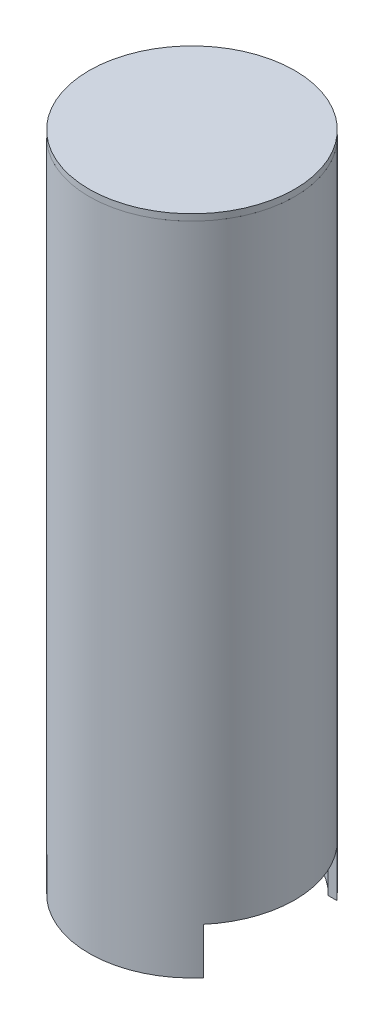
ISO-10303-21;
HEADER;
FILE_DESCRIPTION(('STEP AP214'),'2;1');
FILE_NAME('part.step','',(''),(''),'','','');
FILE_SCHEMA(('AUTOMOTIVE_DESIGN { 1 0 10303 214 1 1 1 1 }'));
ENDSEC;
DATA;
#1=APPLICATION_CONTEXT('core data for automotive mechanical design processes');
#2=APPLICATION_PROTOCOL_DEFINITION('international standard','automotive_design',2000,#1);
#3=PRODUCT_CONTEXT('',#1,'mechanical');
#4=PRODUCT('Part','Part','',(#3));
#5=PRODUCT_RELATED_PRODUCT_CATEGORY('part','',(#4));
#6=PRODUCT_DEFINITION_FORMATION('','',#4);
#7=PRODUCT_DEFINITION_CONTEXT('part definition',#1,'design');
#8=PRODUCT_DEFINITION('design','',#6,#7);
#9=PRODUCT_DEFINITION_SHAPE('','',#8);
#10=(LENGTH_UNIT() NAMED_UNIT(*) SI_UNIT(.MILLI.,.METRE.));
#11=(NAMED_UNIT(*) PLANE_ANGLE_UNIT() SI_UNIT($,.RADIAN.));
#12=(NAMED_UNIT(*) SI_UNIT($,.STERADIAN.) SOLID_ANGLE_UNIT());
#13=UNCERTAINTY_MEASURE_WITH_UNIT(LENGTH_MEASURE(1.E-05),#10,'distance_accuracy_value','');
#14=(GEOMETRIC_REPRESENTATION_CONTEXT(3) GLOBAL_UNCERTAINTY_ASSIGNED_CONTEXT((#13)) GLOBAL_UNIT_ASSIGNED_CONTEXT((#10,
#11,#12)) REPRESENTATION_CONTEXT('',''));
#15=CARTESIAN_POINT('',(0.,0.,0.));
#16=DIRECTION('',(0.,0.,1.));
#17=DIRECTION('',(1.,0.,0.));
#18=AXIS2_PLACEMENT_3D('',#15,#16,#17);
#19=CARTESIAN_POINT('',(0.,28.575,0.));
#20=DIRECTION('',(0.,-1.,0.));
#21=DIRECTION('',(0.,0.,-1.));
#22=AXIS2_PLACEMENT_3D('',#19,#20,#21);
#23=CYLINDRICAL_SURFACE('',#22,3.175);
#24=CARTESIAN_POINT('',(0.,28.575,0.));
#25=DIRECTION('',(0.,1.,0.));
#26=DIRECTION('',(0.,0.,1.));
#27=AXIS2_PLACEMENT_3D('',#24,#25,#26);
#28=CIRCLE('',#27,3.175);
#29=CARTESIAN_POINT('',(0.,28.575,-3.175));
#30=VERTEX_POINT('',#29);
#31=EDGE_CURVE('E58',#30,#30,#28,.T.);
#32=CARTESIAN_POINT('',(0.,26.67,0.));
#33=DIRECTION('',(0.,1.,0.));
#34=DIRECTION('',(0.,0.,1.));
#35=AXIS2_PLACEMENT_3D('',#32,#33,#34);
#36=CIRCLE('',#35,3.175);
#37=CARTESIAN_POINT('',(0.,26.67,-3.175));
#38=VERTEX_POINT('',#37);
#39=EDGE_CURVE('E54',#38,#38,#36,.T.);
#40=CARTESIAN_POINT('',(0.,28.575,-3.175));
#41=CARTESIAN_POINT('',(0.,28.55515625,-3.175));
#42=CARTESIAN_POINT('',(0.,28.5353125,-3.175));
#43=CARTESIAN_POINT('',(0.,28.495625,-3.175));
#44=CARTESIAN_POINT('',(0.,28.47578125,-3.175));
#45=CARTESIAN_POINT('',(0.,28.43609375,-3.175));
#46=CARTESIAN_POINT('',(0.,28.41625,-3.175));
#47=CARTESIAN_POINT('',(0.,28.3765625,-3.175));
#48=CARTESIAN_POINT('',(0.,28.35671875,-3.175));
#49=CARTESIAN_POINT('',(0.,28.31703125,-3.175));
#50=CARTESIAN_POINT('',(0.,28.2971875,-3.175));
#51=CARTESIAN_POINT('',(0.,28.2575,-3.175));
#52=CARTESIAN_POINT('',(0.,28.23765625,-3.175));
#53=CARTESIAN_POINT('',(0.,28.19796875,-3.175));
#54=CARTESIAN_POINT('',(0.,28.178125,-3.175));
#55=CARTESIAN_POINT('',(0.,28.1384375,-3.175));
#56=CARTESIAN_POINT('',(0.,28.11859375,-3.175));
#57=CARTESIAN_POINT('',(0.,28.07890625,-3.175));
#58=CARTESIAN_POINT('',(0.,28.0590625,-3.175));
#59=CARTESIAN_POINT('',(0.,28.019375,-3.175));
#60=CARTESIAN_POINT('',(0.,27.99953125,-3.175));
#61=CARTESIAN_POINT('',(0.,27.95984375,-3.175));
#62=CARTESIAN_POINT('',(0.,27.94,-3.175));
#63=CARTESIAN_POINT('',(0.,27.9003125,-3.175));
#64=CARTESIAN_POINT('',(0.,27.88046875,-3.175));
#65=CARTESIAN_POINT('',(0.,27.84078125,-3.175));
#66=CARTESIAN_POINT('',(0.,27.8209375,-3.175));
#67=CARTESIAN_POINT('',(0.,27.78125,-3.175));
#68=CARTESIAN_POINT('',(0.,27.76140625,-3.175));
#69=CARTESIAN_POINT('',(0.,27.72171875,-3.175));
#70=CARTESIAN_POINT('',(0.,27.701875,-3.175));
#71=CARTESIAN_POINT('',(0.,27.6621875,-3.175));
#72=CARTESIAN_POINT('',(0.,27.64234375,-3.175));
#73=CARTESIAN_POINT('',(0.,27.60265625,-3.175));
#74=CARTESIAN_POINT('',(0.,27.5828125,-3.175));
#75=CARTESIAN_POINT('',(0.,27.543125,-3.175));
#76=CARTESIAN_POINT('',(0.,27.52328125,-3.175));
#77=CARTESIAN_POINT('',(0.,27.48359375,-3.175));
#78=CARTESIAN_POINT('',(0.,27.46375,-3.175));
#79=CARTESIAN_POINT('',(0.,27.4240625,-3.175));
#80=CARTESIAN_POINT('',(0.,27.40421875,-3.175));
#81=CARTESIAN_POINT('',(0.,27.36453125,-3.175));
#82=CARTESIAN_POINT('',(0.,27.3446875,-3.175));
#83=CARTESIAN_POINT('',(0.,27.305,-3.175));
#84=CARTESIAN_POINT('',(0.,27.28515625,-3.175));
#85=CARTESIAN_POINT('',(0.,27.24546875,-3.175));
#86=CARTESIAN_POINT('',(0.,27.225625,-3.175));
#87=CARTESIAN_POINT('',(0.,27.1859375,-3.175));
#88=CARTESIAN_POINT('',(0.,27.16609375,-3.175));
#89=CARTESIAN_POINT('',(0.,27.12640625,-3.175));
#90=CARTESIAN_POINT('',(0.,27.1065625,-3.175));
#91=CARTESIAN_POINT('',(0.,27.066875,-3.175));
#92=CARTESIAN_POINT('',(0.,27.04703125,-3.175));
#93=CARTESIAN_POINT('',(0.,27.00734375,-3.175));
#94=CARTESIAN_POINT('',(0.,26.9875,-3.175));
#95=CARTESIAN_POINT('',(0.,26.9478125,-3.175));
#96=CARTESIAN_POINT('',(0.,26.92796875,-3.175));
#97=CARTESIAN_POINT('',(0.,26.88828125,-3.175));
#98=CARTESIAN_POINT('',(0.,26.8684375,-3.175));
#99=CARTESIAN_POINT('',(0.,26.82875,-3.175));
#100=CARTESIAN_POINT('',(0.,26.80890625,-3.175));
#101=CARTESIAN_POINT('',(0.,26.76921875,-3.175));
#102=CARTESIAN_POINT('',(0.,26.749375,-3.175));
#103=CARTESIAN_POINT('',(0.,26.7096875,-3.175));
#104=CARTESIAN_POINT('',(0.,26.68984375,-3.175));
#105=CARTESIAN_POINT('',(0.,26.67,-3.175));
#106=B_SPLINE_CURVE_WITH_KNOTS('',3,(#40,#41,#42,#43,#44,#45,#46,#47,#48,#49,#50,#51,#52,#53,
#54,#55,#56,#57,#58,#59,#60,#61,#62,#63,#64,#65,#66,#67,#68,#69,#70,#71,#72,#73,#74,#75,#76,#77,
#78,#79,#80,#81,#82,#83,#84,#85,#86,#87,#88,#89,#90,#91,#92,#93,#94,#95,#96,#97,#98,#99,#100,
#101,#102,#103,#104,#105),.UNSPECIFIED.,.F.,.F.,(4,2,2,2,2,2,2,2,2,2,2,2,2,2,2,2,2,2,2,2,2,2,2,
2,2,2,2,2,2,2,2,2,4),(0.,0.0595312500000014,0.119062500000003,0.178593750000001,
0.238125000000002,0.29765625,0.357187500000002,0.416718750000003,0.476250000000001,
0.535781250000002,0.5953125,0.654843750000002,0.714375000000003,0.773906250000001,
0.833437500000003,0.892968750000001,0.952500000000002,1.01203125,1.0715625,1.13109375,1.190625,
1.25015625,1.3096875,1.36921875,1.42875,1.48828125,1.5478125,1.60734375,1.666875,1.72640625,
1.7859375,1.84546875,1.905),.UNSPECIFIED.);
#107=EDGE_CURVE('BSEAM51',#30,#38,#106,.T.);
#108=ORIENTED_EDGE('',*,*,#31,.F.);
#109=ORIENTED_EDGE('',*,*,#39,.T.);
#110=ORIENTED_EDGE('',*,*,#107,.T.);
#111=ORIENTED_EDGE('',*,*,#107,.F.);
#112=EDGE_LOOP('',(#108,#110,#109,#111));
#113=FACE_BOUND('',#112,.T.);
#114=ADVANCED_FACE('F51',(#113),#23,.T.);
#115=CARTESIAN_POINT('',(0.,28.575,0.));
#116=DIRECTION('',(0.,1.,0.));
#117=DIRECTION('',(0.,0.,1.));
#118=AXIS2_PLACEMENT_3D('',#115,#116,#117);
#119=PLANE('',#118);
#120=CARTESIAN_POINT('',(0.,28.575,0.));
#121=DIRECTION('',(0.,1.,0.));
#122=DIRECTION('',(0.,0.,1.));
#123=AXIS2_PLACEMENT_3D('',#120,#121,#122);
#124=CIRCLE('',#123,1.905);
#125=CARTESIAN_POINT('',(0.,28.575,1.905));
#126=VERTEX_POINT('',#125);
#127=EDGE_CURVE('E11',#126,#126,#124,.T.);
#128=ORIENTED_EDGE('',*,*,#127,.F.);
#129=EDGE_LOOP('',(#128));
#130=FACE_BOUND('',#129,.T.);
#131=ORIENTED_EDGE('',*,*,#31,.T.);
#132=EDGE_LOOP('',(#131));
#133=FACE_BOUND('',#132,.T.);
#134=ADVANCED_FACE('F75',(#130,#133),#119,.T.);
#135=CARTESIAN_POINT('',(0.,26.67,0.));
#136=DIRECTION('',(0.,1.,0.));
#137=DIRECTION('',(0.,0.,1.));
#138=AXIS2_PLACEMENT_3D('',#135,#136,#137);
#139=PLANE('',#138);
#140=ORIENTED_EDGE('',*,*,#39,.F.);
#141=EDGE_LOOP('',(#140));
#142=FACE_BOUND('',#141,.T.);
#143=ADVANCED_FACE('F72',(#142),#139,.F.);
#144=CARTESIAN_POINT('',(0.,29.21,0.));
#145=DIRECTION('',(0.,-1.,0.));
#146=DIRECTION('',(0.,0.,-1.));
#147=AXIS2_PLACEMENT_3D('',#144,#145,#146);
#148=CYLINDRICAL_SURFACE('',#147,1.905);
#149=CARTESIAN_POINT('',(0.,29.21,0.));
#150=DIRECTION('',(0.,1.,0.));
#151=DIRECTION('',(0.,0.,1.));
#152=AXIS2_PLACEMENT_3D('',#149,#150,#151);
#153=CIRCLE('',#152,1.905);
#154=CARTESIAN_POINT('',(0.,29.21,1.905));
#155=VERTEX_POINT('',#154);
#156=EDGE_CURVE('E64',#155,#155,#153,.T.);
#157=ORIENTED_EDGE('',*,*,#156,.F.);
#158=EDGE_LOOP('',(#157));
#159=FACE_BOUND('',#158,.T.);
#160=ORIENTED_EDGE('',*,*,#127,.T.);
#161=EDGE_LOOP('',(#160));
#162=FACE_BOUND('',#161,.T.);
#163=ADVANCED_FACE('F74',(#159,#162),#148,.T.);
#164=CARTESIAN_POINT('',(0.,29.21,0.));
#165=DIRECTION('',(0.,1.,0.));
#166=DIRECTION('',(0.,0.,1.));
#167=AXIS2_PLACEMENT_3D('',#164,#165,#166);
#168=PLANE('',#167);
#169=ORIENTED_EDGE('',*,*,#156,.T.);
#170=EDGE_LOOP('',(#169));
#171=FACE_BOUND('',#170,.T.);
#172=ADVANCED_FACE('F80',(#171),#168,.T.);
#173=CLOSED_SHELL('',(#114,#134,#143,#163,#172));
#174=MANIFOLD_SOLID_BREP('B2',#173);
#175=CARTESIAN_POINT('',(0.,318.135,0.));
#176=DIRECTION('',(0.,1.,0.));
#177=DIRECTION('',(0.,0.,1.));
#178=AXIS2_PLACEMENT_3D('',#175,#176,#177);
#179=CYLINDRICAL_SURFACE('',#178,46.99);
#180=CARTESIAN_POINT('',(0.,318.135,0.));
#181=DIRECTION('',(0.,1.,0.));
#182=DIRECTION('',(0.,0.,1.));
#183=AXIS2_PLACEMENT_3D('',#180,#181,#182);
#184=CIRCLE('',#183,46.99);
#185=CARTESIAN_POINT('',(0.,318.135,46.99));
#186=VERTEX_POINT('',#185);
#187=EDGE_CURVE('E50',#186,#186,#184,.T.);
#188=ORIENTED_EDGE('',*,*,#187,.T.);
#189=EDGE_LOOP('',(#188));
#190=FACE_BOUND('',#189,.T.);
#191=CARTESIAN_POINT('',(0.,323.85,0.));
#192=DIRECTION('',(0.,1.,0.));
#193=DIRECTION('',(0.,0.,1.));
#194=AXIS2_PLACEMENT_3D('',#191,#192,#193);
#195=CIRCLE('',#194,46.99);
#196=CARTESIAN_POINT('',(0.,323.85,46.99));
#197=VERTEX_POINT('',#196);
#198=EDGE_CURVE('E138',#197,#197,#195,.T.);
#199=ORIENTED_EDGE('',*,*,#198,.F.);
#200=EDGE_LOOP('',(#199));
#201=FACE_BOUND('',#200,.T.);
#202=ADVANCED_FACE('F135',(#190,#201),#179,.T.);
#203=CARTESIAN_POINT('',(0.,318.135,0.));
#204=DIRECTION('',(0.,1.,0.));
#205=DIRECTION('',(0.,0.,1.));
#206=AXIS2_PLACEMENT_3D('',#203,#204,#205);
#207=PLANE('',#206);
#208=ORIENTED_EDGE('',*,*,#187,.F.);
#209=EDGE_LOOP('',(#208));
#210=FACE_BOUND('',#209,.T.);
#211=ADVANCED_FACE('F158',(#210),#207,.F.);
#212=CARTESIAN_POINT('',(0.,327.025,0.));
#213=DIRECTION('',(0.,-1.,0.));
#214=DIRECTION('',(0.,0.,-1.));
#215=AXIS2_PLACEMENT_3D('',#212,#213,#214);
#216=CYLINDRICAL_SURFACE('',#215,50.8);
#217=CARTESIAN_POINT('',(0.,327.025,0.));
#218=DIRECTION('',(0.,1.,0.));
#219=DIRECTION('',(0.,0.,1.));
#220=AXIS2_PLACEMENT_3D('',#217,#218,#219);
#221=CIRCLE('',#220,50.8);
#222=CARTESIAN_POINT('',(0.,327.025,-50.8));
#223=VERTEX_POINT('',#222);
#224=EDGE_CURVE('E145',#223,#223,#221,.T.);
#225=CARTESIAN_POINT('',(0.,323.85,0.));
#226=DIRECTION('',(0.,1.,0.));
#227=DIRECTION('',(0.,0.,1.));
#228=AXIS2_PLACEMENT_3D('',#225,#226,#227);
#229=CIRCLE('',#228,50.8);
#230=CARTESIAN_POINT('',(0.,323.85,-50.8));
#231=VERTEX_POINT('',#230);
#232=EDGE_CURVE('E147',#231,#231,#229,.T.);
#233=CARTESIAN_POINT('',(0.,327.025,-50.8));
#234=CARTESIAN_POINT('',(0.,326.991927083333,-50.8));
#235=CARTESIAN_POINT('',(0.,326.958854166667,-50.8));
#236=CARTESIAN_POINT('',(0.,326.892708333333,-50.8));
#237=CARTESIAN_POINT('',(0.,326.859635416667,-50.8));
#238=CARTESIAN_POINT('',(0.,326.793489583333,-50.8));
#239=CARTESIAN_POINT('',(0.,326.760416666667,-50.8));
#240=CARTESIAN_POINT('',(0.,326.694270833333,-50.8));
#241=CARTESIAN_POINT('',(0.,326.661197916667,-50.8));
#242=CARTESIAN_POINT('',(0.,326.595052083333,-50.8));
#243=CARTESIAN_POINT('',(0.,326.561979166667,-50.8));
#244=CARTESIAN_POINT('',(0.,326.495833333333,-50.8));
#245=CARTESIAN_POINT('',(0.,326.462760416667,-50.8));
#246=CARTESIAN_POINT('',(0.,326.396614583333,-50.8));
#247=CARTESIAN_POINT('',(0.,326.363541666667,-50.8));
#248=CARTESIAN_POINT('',(0.,326.297395833333,-50.8));
#249=CARTESIAN_POINT('',(0.,326.264322916667,-50.8));
#250=CARTESIAN_POINT('',(0.,326.198177083333,-50.8));
#251=CARTESIAN_POINT('',(0.,326.165104166667,-50.8));
#252=CARTESIAN_POINT('',(0.,326.098958333333,-50.8));
#253=CARTESIAN_POINT('',(0.,326.065885416667,-50.8));
#254=CARTESIAN_POINT('',(0.,325.999739583333,-50.8));
#255=CARTESIAN_POINT('',(0.,325.966666666667,-50.8));
#256=CARTESIAN_POINT('',(0.,325.900520833333,-50.8));
#257=CARTESIAN_POINT('',(0.,325.867447916667,-50.8));
#258=CARTESIAN_POINT('',(0.,325.801302083333,-50.8));
#259=CARTESIAN_POINT('',(0.,325.768229166667,-50.8));
#260=CARTESIAN_POINT('',(0.,325.702083333333,-50.8));
#261=CARTESIAN_POINT('',(0.,325.669010416667,-50.8));
#262=CARTESIAN_POINT('',(0.,325.602864583333,-50.8));
#263=CARTESIAN_POINT('',(0.,325.569791666667,-50.8));
#264=CARTESIAN_POINT('',(0.,325.503645833333,-50.8));
#265=CARTESIAN_POINT('',(0.,325.470572916667,-50.8));
#266=CARTESIAN_POINT('',(0.,325.404427083333,-50.8));
#267=CARTESIAN_POINT('',(0.,325.371354166667,-50.8));
#268=CARTESIAN_POINT('',(0.,325.305208333333,-50.8));
#269=CARTESIAN_POINT('',(0.,325.272135416667,-50.8));
#270=CARTESIAN_POINT('',(0.,325.205989583333,-50.8));
#271=CARTESIAN_POINT('',(0.,325.172916666667,-50.8));
#272=CARTESIAN_POINT('',(0.,325.106770833333,-50.8));
#273=CARTESIAN_POINT('',(0.,325.073697916667,-50.8));
#274=CARTESIAN_POINT('',(0.,325.007552083333,-50.8));
#275=CARTESIAN_POINT('',(0.,324.974479166667,-50.8));
#276=CARTESIAN_POINT('',(0.,324.908333333333,-50.8));
#277=CARTESIAN_POINT('',(0.,324.875260416667,-50.8));
#278=CARTESIAN_POINT('',(0.,324.809114583333,-50.8));
#279=CARTESIAN_POINT('',(0.,324.776041666667,-50.8));
#280=CARTESIAN_POINT('',(0.,324.709895833333,-50.8));
#281=CARTESIAN_POINT('',(0.,324.676822916667,-50.8));
#282=CARTESIAN_POINT('',(0.,324.610677083333,-50.8));
#283=CARTESIAN_POINT('',(0.,324.577604166667,-50.8));
#284=CARTESIAN_POINT('',(0.,324.511458333333,-50.8));
#285=CARTESIAN_POINT('',(0.,324.478385416667,-50.8));
#286=CARTESIAN_POINT('',(0.,324.412239583333,-50.8));
#287=CARTESIAN_POINT('',(0.,324.379166666667,-50.8));
#288=CARTESIAN_POINT('',(0.,324.313020833333,-50.8));
#289=CARTESIAN_POINT('',(0.,324.279947916667,-50.8));
#290=CARTESIAN_POINT('',(0.,324.213802083333,-50.8));
#291=CARTESIAN_POINT('',(0.,324.180729166667,-50.8));
#292=CARTESIAN_POINT('',(0.,324.114583333333,-50.8));
#293=CARTESIAN_POINT('',(0.,324.081510416667,-50.8));
#294=CARTESIAN_POINT('',(0.,324.015364583333,-50.8));
#295=CARTESIAN_POINT('',(0.,323.982291666667,-50.8));
#296=CARTESIAN_POINT('',(0.,323.916145833333,-50.8));
#297=CARTESIAN_POINT('',(0.,323.883072916667,-50.8));
#298=CARTESIAN_POINT('',(0.,323.85,-50.8));
#299=B_SPLINE_CURVE_WITH_KNOTS('',3,(#233,#234,#235,#236,#237,#238,#239,#240,#241,#242,#243,
#244,#245,#246,#247,#248,#249,#250,#251,#252,#253,#254,#255,#256,#257,#258,#259,#260,#261,#262,
#263,#264,#265,#266,#267,#268,#269,#270,#271,#272,#273,#274,#275,#276,#277,#278,#279,#280,#281,
#282,#283,#284,#285,#286,#287,#288,#289,#290,#291,#292,#293,#294,#295,#296,#297,#298),
.UNSPECIFIED.,.F.,.F.,(4,2,2,2,2,2,2,2,2,2,2,2,2,2,2,2,2,2,2,2,2,2,2,2,2,2,2,2,2,2,2,2,4),(0.,
0.0992187499999631,0.198437499999982,0.297656249999945,0.396874999999963,0.496093749999982,
0.595312499999945,0.694531249999963,0.793749999999982,0.892968749999945,0.992187499999964,
1.09140624999998,1.19062499999995,1.28984374999996,1.38906249999998,1.48828124999995,
1.58749999999996,1.68671874999998,1.78593749999995,1.88515624999996,1.98437499999998,
2.08359374999995,2.18281249999996,2.28203124999998,2.38124999999995,2.48046874999996,
2.57968749999998,2.67890624999995,2.77812499999996,2.87734374999998,2.97656249999995,
3.07578124999996,3.17499999999998),.UNSPECIFIED.);
#300=EDGE_CURVE('BSEAM155',#223,#231,#299,.T.);
#301=ORIENTED_EDGE('',*,*,#224,.F.);
#302=ORIENTED_EDGE('',*,*,#232,.T.);
#303=ORIENTED_EDGE('',*,*,#300,.T.);
#304=ORIENTED_EDGE('',*,*,#300,.F.);
#305=EDGE_LOOP('',(#301,#303,#302,#304));
#306=FACE_BOUND('',#305,.T.);
#307=ADVANCED_FACE('F155',(#306),#216,.T.);
#308=CARTESIAN_POINT('',(0.,327.025,0.));
#309=DIRECTION('',(0.,1.,0.));
#310=DIRECTION('',(0.,0.,1.));
#311=AXIS2_PLACEMENT_3D('',#308,#309,#310);
#312=PLANE('',#311);
#313=ORIENTED_EDGE('',*,*,#224,.T.);
#314=EDGE_LOOP('',(#313));
#315=FACE_BOUND('',#314,.T.);
#316=ADVANCED_FACE('F153',(#315),#312,.T.);
#317=CARTESIAN_POINT('',(0.,323.85,0.));
#318=DIRECTION('',(0.,1.,0.));
#319=DIRECTION('',(0.,0.,1.));
#320=AXIS2_PLACEMENT_3D('',#317,#318,#319);
#321=PLANE('',#320);
#322=ORIENTED_EDGE('',*,*,#198,.T.);
#323=EDGE_LOOP('',(#322));
#324=FACE_BOUND('',#323,.T.);
#325=ORIENTED_EDGE('',*,*,#232,.F.);
#326=EDGE_LOOP('',(#325));
#327=FACE_BOUND('',#326,.T.);
#328=ADVANCED_FACE('F162',(#324,#327),#321,.F.);
#329=CLOSED_SHELL('',(#202,#211,#307,#316,#328));
#330=MANIFOLD_SOLID_BREP('B6',#329);
#331=CARTESIAN_POINT('',(0.,323.85,0.));
#332=DIRECTION('',(0.,-1.,0.));
#333=DIRECTION('',(0.,0.,-1.));
#334=AXIS2_PLACEMENT_3D('',#331,#332,#333);
#335=CYLINDRICAL_SURFACE('',#334,50.8);
#336=CARTESIAN_POINT('',(0.,323.85,0.));
#337=DIRECTION('',(0.,1.,0.));
#338=DIRECTION('',(0.,0.,1.));
#339=AXIS2_PLACEMENT_3D('',#336,#337,#338);
#340=CIRCLE('',#339,50.8);
#341=CARTESIAN_POINT('',(0.,323.85,50.8));
#342=VERTEX_POINT('',#341);
#343=EDGE_CURVE('E279',#342,#342,#340,.T.);
#344=ORIENTED_EDGE('',*,*,#343,.F.);
#345=EDGE_LOOP('',(#344));
#346=FACE_BOUND('',#345,.T.);
#347=DIRECTION('',(0.,-1.,0.));
#348=VECTOR('',#347,1.);
#349=CARTESIAN_POINT('',(38.6046577500695,323.85,33.02));
#350=LINE('',#349,#348);
#351=CARTESIAN_POINT('',(38.6046577500695,22.86,33.02));
#352=VERTEX_POINT('',#351);
#353=CARTESIAN_POINT('',(38.6046577500695,0.,33.02));
#354=VERTEX_POINT('',#353);
#355=EDGE_CURVE('E263',#352,#354,#350,.T.);
#356=ORIENTED_EDGE('',*,*,#355,.F.);
#357=CARTESIAN_POINT('',(0.,22.86,0.));
#358=DIRECTION('',(0.,-1.,0.));
#359=DIRECTION('',(0.,0.,-1.));
#360=AXIS2_PLACEMENT_3D('',#357,#358,#359);
#361=CIRCLE('',#360,50.8);
#362=CARTESIAN_POINT('',(38.6046577500695,22.86,-33.02));
#363=VERTEX_POINT('',#362);
#364=EDGE_CURVE('E253',#363,#352,#361,.T.);
#365=ORIENTED_EDGE('',*,*,#364,.F.);
#366=DIRECTION('',(0.,-1.,0.));
#367=VECTOR('',#366,1.);
#368=CARTESIAN_POINT('',(38.6046577500697,323.85,-33.0199999999998));
#369=LINE('',#368,#367);
#370=CARTESIAN_POINT('',(38.6046577500695,0.,-33.02));
#371=VERTEX_POINT('',#370);
#372=EDGE_CURVE('E260',#371,#363,#369,.F.);
#373=ORIENTED_EDGE('',*,*,#372,.F.);
#374=CARTESIAN_POINT('',(0.,0.,0.));
#375=DIRECTION('',(0.,1.,0.));
#376=DIRECTION('',(0.,0.,1.));
#377=AXIS2_PLACEMENT_3D('',#374,#375,#376);
#378=CIRCLE('',#377,50.8);
#379=EDGE_CURVE('E269',#371,#354,#378,.T.);
#380=ORIENTED_EDGE('',*,*,#379,.T.);
#381=EDGE_LOOP('',(#356,#365,#373,#380));
#382=FACE_BOUND('',#381,.T.);
#383=ADVANCED_FACE('F214',(#346,#382),#335,.T.);
#384=CARTESIAN_POINT('',(0.,0.,0.));
#385=DIRECTION('',(0.,1.,0.));
#386=DIRECTION('',(0.,0.,1.));
#387=AXIS2_PLACEMENT_3D('',#384,#385,#386);
#388=PLANE('',#387);
#389=DIRECTION('',(-1.,0.,0.));
#390=VECTOR('',#389,1.);
#391=CARTESIAN_POINT('',(58.42,0.,33.02));
#392=LINE('',#391,#390);
#393=CARTESIAN_POINT('',(34.319385556854,0.,33.02));
#394=VERTEX_POINT('',#393);
#395=EDGE_CURVE('E235',#354,#394,#392,.T.);
#396=ORIENTED_EDGE('',*,*,#395,.F.);
#397=ORIENTED_EDGE('',*,*,#379,.F.);
#398=DIRECTION('',(-1.,0.,0.));
#399=VECTOR('',#398,1.);
#400=CARTESIAN_POINT('',(58.42,0.,-33.02));
#401=LINE('',#400,#399);
#402=CARTESIAN_POINT('',(34.319385556854,0.,-33.02));
#403=VERTEX_POINT('',#402);
#404=EDGE_CURVE('E289',#371,#403,#401,.T.);
#405=ORIENTED_EDGE('',*,*,#404,.T.);
#406=CARTESIAN_POINT('',(0.,0.,0.));
#407=DIRECTION('',(0.,-1.,0.));
#408=DIRECTION('',(0.,0.,-1.));
#409=AXIS2_PLACEMENT_3D('',#406,#407,#408);
#410=CIRCLE('',#409,47.625);
#411=EDGE_CURVE('E270',#394,#403,#410,.T.);
#412=ORIENTED_EDGE('',*,*,#411,.F.);
#413=EDGE_LOOP('',(#396,#397,#405,#412));
#414=FACE_BOUND('',#413,.T.);
#415=ADVANCED_FACE('F293',(#414),#388,.F.);
#416=CARTESIAN_POINT('',(0.,25.4,0.));
#417=DIRECTION('',(0.,-1.,0.));
#418=DIRECTION('',(0.,0.,-1.));
#419=AXIS2_PLACEMENT_3D('',#416,#417,#418);
#420=CYLINDRICAL_SURFACE('',#419,47.625);
#421=CARTESIAN_POINT('',(0.,25.4,0.));
#422=DIRECTION('',(0.,-1.,0.));
#423=DIRECTION('',(0.,0.,-1.));
#424=AXIS2_PLACEMENT_3D('',#421,#422,#423);
#425=CIRCLE('',#424,47.625);
#426=CARTESIAN_POINT('',(0.,25.4,-47.625));
#427=VERTEX_POINT('',#426);
#428=EDGE_CURVE('E273',#427,#427,#425,.T.);
#429=ORIENTED_EDGE('',*,*,#428,.F.);
#430=EDGE_LOOP('',(#429));
#431=FACE_BOUND('',#430,.T.);
#432=DIRECTION('',(0.,-1.,0.));
#433=VECTOR('',#432,1.);
#434=CARTESIAN_POINT('',(34.319385556854,25.4,33.02));
#435=LINE('',#434,#433);
#436=CARTESIAN_POINT('',(34.319385556854,22.86,33.02));
#437=VERTEX_POINT('',#436);
#438=EDGE_CURVE('E133',#394,#437,#435,.F.);
#439=ORIENTED_EDGE('',*,*,#438,.F.);
#440=ORIENTED_EDGE('',*,*,#411,.T.);
#441=DIRECTION('',(0.,-1.,0.));
#442=VECTOR('',#441,1.);
#443=CARTESIAN_POINT('',(34.319385556854,25.4,-33.02));
#444=LINE('',#443,#442);
#445=CARTESIAN_POINT('',(34.319385556854,22.86,-33.02));
#446=VERTEX_POINT('',#445);
#447=EDGE_CURVE('E222',#446,#403,#444,.T.);
#448=ORIENTED_EDGE('',*,*,#447,.F.);
#449=CARTESIAN_POINT('',(0.,22.86,0.));
#450=DIRECTION('',(0.,-1.,0.));
#451=DIRECTION('',(0.,0.,-1.));
#452=AXIS2_PLACEMENT_3D('',#449,#450,#451);
#453=CIRCLE('',#452,47.625);
#454=EDGE_CURVE('E282',#437,#446,#453,.F.);
#455=ORIENTED_EDGE('',*,*,#454,.F.);
#456=EDGE_LOOP('',(#439,#440,#448,#455));
#457=FACE_BOUND('',#456,.T.);
#458=ADVANCED_FACE('F295',(#431,#457),#420,.F.);
#459=CARTESIAN_POINT('',(0.,323.85,0.));
#460=DIRECTION('',(0.,1.,0.));
#461=DIRECTION('',(0.,0.,1.));
#462=AXIS2_PLACEMENT_3D('',#459,#460,#461);
#463=PLANE('',#462);
#464=CARTESIAN_POINT('',(0.,323.85,0.));
#465=DIRECTION('',(0.,1.,0.));
#466=DIRECTION('',(0.,0.,1.));
#467=AXIS2_PLACEMENT_3D('',#464,#465,#466);
#468=CIRCLE('',#467,47.625);
#469=CARTESIAN_POINT('',(0.,323.85,47.625));
#470=VERTEX_POINT('',#469);
#471=EDGE_CURVE('E265',#470,#470,#468,.T.);
#472=ORIENTED_EDGE('',*,*,#471,.F.);
#473=EDGE_LOOP('',(#472));
#474=FACE_BOUND('',#473,.T.);
#475=ORIENTED_EDGE('',*,*,#343,.T.);
#476=EDGE_LOOP('',(#475));
#477=FACE_BOUND('',#476,.T.);
#478=ADVANCED_FACE('F297',(#474,#477),#463,.T.);
#479=CARTESIAN_POINT('',(0.,25.4,0.));
#480=DIRECTION('',(0.,-1.,0.));
#481=DIRECTION('',(0.,0.,-1.));
#482=AXIS2_PLACEMENT_3D('',#479,#480,#481);
#483=PLANE('',#482);
#484=CARTESIAN_POINT('',(0.,25.4,0.));
#485=DIRECTION('',(0.,-1.,0.));
#486=DIRECTION('',(0.,0.,-1.));
#487=AXIS2_PLACEMENT_3D('',#484,#485,#486);
#488=CIRCLE('',#487,1.27);
#489=CARTESIAN_POINT('',(0.,25.4,-1.27));
#490=VERTEX_POINT('',#489);
#491=EDGE_CURVE('E400',#490,#490,#488,.T.);
#492=ORIENTED_EDGE('',*,*,#491,.F.);
#493=EDGE_LOOP('',(#492));
#494=FACE_BOUND('',#493,.T.);
#495=ORIENTED_EDGE('',*,*,#428,.T.);
#496=EDGE_LOOP('',(#495));
#497=FACE_BOUND('',#496,.T.);
#498=ADVANCED_FACE('F304',(#494,#497),#483,.T.);
#499=CARTESIAN_POINT('',(58.42,0.,33.02));
#500=DIRECTION('',(0.,0.,-1.));
#501=DIRECTION('',(-1.,0.,0.));
#502=AXIS2_PLACEMENT_3D('',#499,#500,#501);
#503=PLANE('',#502);
#504=ORIENTED_EDGE('',*,*,#355,.T.);
#505=ORIENTED_EDGE('',*,*,#395,.T.);
#506=ORIENTED_EDGE('',*,*,#438,.T.);
#507=DIRECTION('',(-1.,0.,0.));
#508=VECTOR('',#507,1.);
#509=CARTESIAN_POINT('',(58.42,22.86,33.02));
#510=LINE('',#509,#508);
#511=EDGE_CURVE('E229',#352,#437,#510,.T.);
#512=ORIENTED_EDGE('',*,*,#511,.F.);
#513=EDGE_LOOP('',(#504,#505,#506,#512));
#514=FACE_BOUND('',#513,.T.);
#515=ADVANCED_FACE('F262',(#514),#503,.T.);
#516=CARTESIAN_POINT('',(58.42,22.86,-33.02));
#517=DIRECTION('',(0.,0.,1.));
#518=DIRECTION('',(0.,-1.,0.));
#519=AXIS2_PLACEMENT_3D('',#516,#517,#518);
#520=PLANE('',#519);
#521=ORIENTED_EDGE('',*,*,#372,.T.);
#522=DIRECTION('',(-1.,0.,0.));
#523=VECTOR('',#522,1.);
#524=CARTESIAN_POINT('',(58.42,22.86,-33.02));
#525=LINE('',#524,#523);
#526=EDGE_CURVE('E256',#363,#446,#525,.T.);
#527=ORIENTED_EDGE('',*,*,#526,.T.);
#528=ORIENTED_EDGE('',*,*,#447,.T.);
#529=ORIENTED_EDGE('',*,*,#404,.F.);
#530=EDGE_LOOP('',(#521,#527,#528,#529));
#531=FACE_BOUND('',#530,.T.);
#532=ADVANCED_FACE('F288',(#531),#520,.T.);
#533=CARTESIAN_POINT('',(58.42,22.86,33.02));
#534=DIRECTION('',(0.,-1.,0.));
#535=DIRECTION('',(0.,0.,-1.));
#536=AXIS2_PLACEMENT_3D('',#533,#534,#535);
#537=PLANE('',#536);
#538=ORIENTED_EDGE('',*,*,#364,.T.);
#539=ORIENTED_EDGE('',*,*,#511,.T.);
#540=ORIENTED_EDGE('',*,*,#454,.T.);
#541=ORIENTED_EDGE('',*,*,#526,.F.);
#542=EDGE_LOOP('',(#538,#539,#540,#541));
#543=FACE_BOUND('',#542,.T.);
#544=ADVANCED_FACE('F254',(#543),#537,.T.);
#545=CARTESIAN_POINT('',(0.,323.85,0.));
#546=DIRECTION('',(0.,-1.,0.));
#547=DIRECTION('',(0.,0.,-1.));
#548=AXIS2_PLACEMENT_3D('',#545,#546,#547);
#549=CYLINDRICAL_SURFACE('',#548,47.625);
#550=ORIENTED_EDGE('',*,*,#471,.T.);
#551=EDGE_LOOP('',(#550));
#552=FACE_BOUND('',#551,.T.);
#553=CARTESIAN_POINT('',(0.,26.67,0.));
#554=DIRECTION('',(0.,1.,0.));
#555=DIRECTION('',(0.,0.,1.));
#556=AXIS2_PLACEMENT_3D('',#553,#554,#555);
#557=CIRCLE('',#556,47.625);
#558=CARTESIAN_POINT('',(0.,26.67,47.625));
#559=VERTEX_POINT('',#558);
#560=EDGE_CURVE('E402',#559,#559,#557,.T.);
#561=ORIENTED_EDGE('',*,*,#560,.F.);
#562=EDGE_LOOP('',(#561));
#563=FACE_BOUND('',#562,.T.);
#564=ADVANCED_FACE('F350',(#552,#563),#549,.F.);
#565=CARTESIAN_POINT('',(0.,26.67,0.));
#566=DIRECTION('',(0.,1.,0.));
#567=DIRECTION('',(0.,0.,1.));
#568=AXIS2_PLACEMENT_3D('',#565,#566,#567);
#569=PLANE('',#568);
#570=CARTESIAN_POINT('',(0.,26.67,0.));
#571=DIRECTION('',(0.,1.,0.));
#572=DIRECTION('',(0.,0.,1.));
#573=AXIS2_PLACEMENT_3D('',#570,#571,#572);
#574=CIRCLE('',#573,1.27);
#575=CARTESIAN_POINT('',(0.,26.67,1.27));
#576=VERTEX_POINT('',#575);
#577=EDGE_CURVE('E217',#576,#576,#574,.T.);
#578=ORIENTED_EDGE('',*,*,#577,.F.);
#579=EDGE_LOOP('',(#578));
#580=FACE_BOUND('',#579,.T.);
#581=ORIENTED_EDGE('',*,*,#560,.T.);
#582=EDGE_LOOP('',(#581));
#583=FACE_BOUND('',#582,.T.);
#584=ADVANCED_FACE('F365',(#580,#583),#569,.T.);
#585=CARTESIAN_POINT('',(0.,27.178,0.));
#586=DIRECTION('',(0.,-1.,0.));
#587=DIRECTION('',(0.,0.,-1.));
#588=AXIS2_PLACEMENT_3D('',#585,#586,#587);
#589=CYLINDRICAL_SURFACE('',#588,1.27);
#590=ORIENTED_EDGE('',*,*,#577,.T.);
#591=EDGE_LOOP('',(#590));
#592=FACE_BOUND('',#591,.T.);
#593=ORIENTED_EDGE('',*,*,#491,.T.);
#594=EDGE_LOOP('',(#593));
#595=FACE_BOUND('',#594,.T.);
#596=ADVANCED_FACE('F381',(#592,#595),#589,.F.);
#597=CLOSED_SHELL('',(#383,#415,#458,#478,#498,#515,#532,#544,#564,#584,#596));
#598=MANIFOLD_SOLID_BREP('B45',#597);
#599=ADVANCED_BREP_SHAPE_REPRESENTATION('',(#18,#174,#330,#598),#14);
#600=SHAPE_DEFINITION_REPRESENTATION(#9,#599);
ENDSEC;
END-ISO-10303-21;
